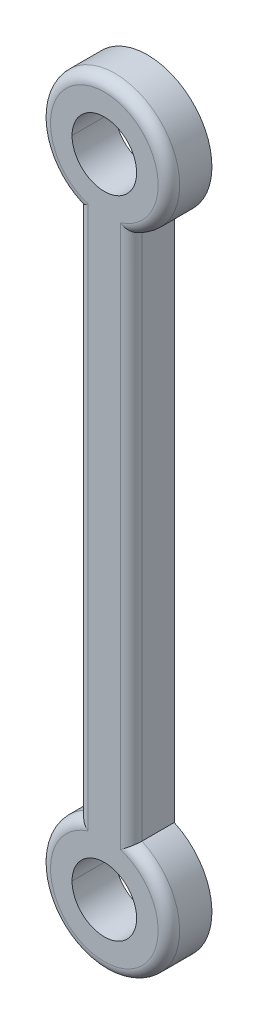
ISO-10303-21;
HEADER;
FILE_DESCRIPTION(('STEP AP214'),'2;1');
FILE_NAME('part.step','',(''),(''),'','','');
FILE_SCHEMA(('AUTOMOTIVE_DESIGN { 1 0 10303 214 1 1 1 1 }'));
ENDSEC;
DATA;
#1=APPLICATION_CONTEXT('core data for automotive mechanical design processes');
#2=APPLICATION_PROTOCOL_DEFINITION('international standard','automotive_design',2000,#1);
#3=PRODUCT_CONTEXT('',#1,'mechanical');
#4=PRODUCT('Part','Part','',(#3));
#5=PRODUCT_RELATED_PRODUCT_CATEGORY('part','',(#4));
#6=PRODUCT_DEFINITION_FORMATION('','',#4);
#7=PRODUCT_DEFINITION_CONTEXT('part definition',#1,'design');
#8=PRODUCT_DEFINITION('design','',#6,#7);
#9=PRODUCT_DEFINITION_SHAPE('','',#8);
#10=(LENGTH_UNIT() NAMED_UNIT(*) SI_UNIT(.MILLI.,.METRE.));
#11=(NAMED_UNIT(*) PLANE_ANGLE_UNIT() SI_UNIT($,.RADIAN.));
#12=(NAMED_UNIT(*) SI_UNIT($,.STERADIAN.) SOLID_ANGLE_UNIT());
#13=UNCERTAINTY_MEASURE_WITH_UNIT(LENGTH_MEASURE(1.E-05),#10,'distance_accuracy_value','');
#14=(GEOMETRIC_REPRESENTATION_CONTEXT(3) GLOBAL_UNCERTAINTY_ASSIGNED_CONTEXT((#13)) GLOBAL_UNIT_ASSIGNED_CONTEXT((#10,
#11,#12)) REPRESENTATION_CONTEXT('',''));
#15=CARTESIAN_POINT('',(0.,0.,0.));
#16=DIRECTION('',(0.,0.,1.));
#17=DIRECTION('',(1.,0.,0.));
#18=AXIS2_PLACEMENT_3D('',#15,#16,#17);
#19=CARTESIAN_POINT('',(287.2957574495,-205.174437105941,53.449999999999));
#20=DIRECTION('',(0.,0.,1.));
#21=DIRECTION('',(-1.,0.,0.));
#22=AXIS2_PLACEMENT_3D('',#19,#20,#21);
#23=PLANE('',#22);
#24=CARTESIAN_POINT('',(287.2957574495,-175.174437105941,53.4499999999991));
#25=DIRECTION('',(0.,0.,-1.));
#26=DIRECTION('',(1.,0.,0.));
#27=AXIS2_PLACEMENT_3D('',#24,#25,#26);
#28=CIRCLE('',#27,1.5);
#29=CARTESIAN_POINT('',(288.7957574495,-175.174437105941,53.4499999999991));
#30=VERTEX_POINT('',#29);
#31=CARTESIAN_POINT('',(285.7957574495,-175.174437105941,53.4499999999991));
#32=VERTEX_POINT('',#31);
#33=EDGE_CURVE('E315',#30,#32,#28,.T.);
#34=ORIENTED_EDGE('',*,*,#33,.F.);
#35=CARTESIAN_POINT('',(287.2957574495,-175.174437105941,53.4499999999991));
#36=DIRECTION('',(0.,0.,-1.));
#37=DIRECTION('',(-1.,0.,0.));
#38=AXIS2_PLACEMENT_3D('',#35,#36,#37);
#39=CIRCLE('',#38,1.5);
#40=EDGE_CURVE('E66',#32,#30,#39,.T.);
#41=ORIENTED_EDGE('',*,*,#40,.F.);
#42=EDGE_LOOP('',(#34,#41));
#43=FACE_BOUND('',#42,.T.);
#44=CARTESIAN_POINT('',(287.2957574495,-205.174437105941,53.449999999999));
#45=DIRECTION('',(0.,0.,1.));
#46=DIRECTION('',(1.,0.,0.));
#47=AXIS2_PLACEMENT_3D('',#44,#45,#46);
#48=CIRCLE('',#47,1.5);
#49=CARTESIAN_POINT('',(288.7957574495,-205.174437105941,53.449999999999));
#50=VERTEX_POINT('',#49);
#51=CARTESIAN_POINT('',(285.7957574495,-205.174437105941,53.449999999999));
#52=VERTEX_POINT('',#51);
#53=EDGE_CURVE('E11',#50,#52,#48,.T.);
#54=ORIENTED_EDGE('',*,*,#53,.T.);
#55=CARTESIAN_POINT('',(287.2957574495,-205.174437105941,53.449999999999));
#56=DIRECTION('',(0.,0.,1.));
#57=DIRECTION('',(-1.,0.,0.));
#58=AXIS2_PLACEMENT_3D('',#55,#56,#57);
#59=CIRCLE('',#58,1.5);
#60=EDGE_CURVE('E57',#52,#50,#59,.T.);
#61=ORIENTED_EDGE('',*,*,#60,.T.);
#62=EDGE_LOOP('',(#54,#61));
#63=FACE_BOUND('',#62,.T.);
#64=DIRECTION('',(0.,-1.,0.));
#65=VECTOR('',#64,1.);
#66=CARTESIAN_POINT('',(286.0457574495,-177.9016151346,53.4499999999991));
#67=LINE('',#66,#65);
#68=CARTESIAN_POINT('',(286.0457574495,-177.9016151346,53.4499999999991));
#69=VERTEX_POINT('',#68);
#70=CARTESIAN_POINT('',(286.0457574495,-202.447259077282,53.449999999999));
#71=VERTEX_POINT('',#70);
#72=EDGE_CURVE('E268',#69,#71,#67,.T.);
#73=ORIENTED_EDGE('',*,*,#72,.F.);
#74=CARTESIAN_POINT('',(287.2957574495,-175.174437105941,53.4499999999991));
#75=DIRECTION('',(0.,0.,1.));
#76=DIRECTION('',(0.416666666666667,-0.90905934288631,0.));
#77=AXIS2_PLACEMENT_3D('',#74,#75,#76);
#78=CIRCLE('',#77,3.);
#79=CARTESIAN_POINT('',(288.5457574495,-177.9016151346,53.4499999999991));
#80=VERTEX_POINT('',#79);
#81=EDGE_CURVE('E159',#80,#69,#78,.T.);
#82=ORIENTED_EDGE('',*,*,#81,.F.);
#83=DIRECTION('',(0.,1.,0.));
#84=VECTOR('',#83,1.);
#85=CARTESIAN_POINT('',(288.5457574495,-202.447259077282,53.449999999999));
#86=LINE('',#85,#84);
#87=CARTESIAN_POINT('',(288.5457574495,-202.447259077282,53.449999999999));
#88=VERTEX_POINT('',#87);
#89=EDGE_CURVE('E193',#88,#80,#86,.T.);
#90=ORIENTED_EDGE('',*,*,#89,.F.);
#91=CARTESIAN_POINT('',(287.2957574495,-205.174437105941,53.449999999999));
#92=DIRECTION('',(0.,0.,1.));
#93=DIRECTION('',(-0.416666666666667,0.90905934288631,0.));
#94=AXIS2_PLACEMENT_3D('',#91,#92,#93);
#95=CIRCLE('',#94,3.);
#96=EDGE_CURVE('E252',#71,#88,#95,.T.);
#97=ORIENTED_EDGE('',*,*,#96,.F.);
#98=EDGE_LOOP('',(#73,#82,#90,#97));
#99=FACE_BOUND('',#98,.T.);
#100=ADVANCED_FACE('F46',(#43,#63,#99),#23,.F.);
#101=CARTESIAN_POINT('',(287.2957574495,-175.174437105941,55.4499999999991));
#102=DIRECTION('',(0.,0.,1.));
#103=DIRECTION('',(-1.,0.,0.));
#104=AXIS2_PLACEMENT_3D('',#101,#102,#103);
#105=CYLINDRICAL_SURFACE('',#104,1.5);
#106=CARTESIAN_POINT('',(287.2957574495,-175.174437105941,55.4499999999991));
#107=DIRECTION('',(0.,0.,-1.));
#108=DIRECTION('',(1.,0.,0.));
#109=AXIS2_PLACEMENT_3D('',#106,#107,#108);
#110=CIRCLE('',#109,1.5);
#111=CARTESIAN_POINT('',(288.7957574495,-175.174437105941,55.4499999999991));
#112=VERTEX_POINT('',#111);
#113=CARTESIAN_POINT('',(285.7957574495,-175.174437105941,55.4499999999991));
#114=VERTEX_POINT('',#113);
#115=EDGE_CURVE('E144',#112,#114,#110,.T.);
#116=ORIENTED_EDGE('',*,*,#115,.F.);
#117=DIRECTION('',(0.,0.,-1.));
#118=VECTOR('',#117,1.);
#119=CARTESIAN_POINT('',(288.7957574495,-175.174437105941,55.4499999999991));
#120=LINE('',#119,#118);
#121=EDGE_CURVE('E309',#112,#30,#120,.T.);
#122=ORIENTED_EDGE('',*,*,#121,.T.);
#123=ORIENTED_EDGE('',*,*,#33,.T.);
#124=DIRECTION('',(0.,0.,-1.));
#125=VECTOR('',#124,1.);
#126=CARTESIAN_POINT('',(285.7957574495,-175.174437105941,55.4499999999991));
#127=LINE('',#126,#125);
#128=EDGE_CURVE('E310',#114,#32,#127,.T.);
#129=ORIENTED_EDGE('',*,*,#128,.F.);
#130=EDGE_LOOP('',(#116,#122,#123,#129));
#131=FACE_BOUND('',#130,.T.);
#132=ADVANCED_FACE('F307',(#131),#105,.F.);
#133=CARTESIAN_POINT('',(287.2957574495,-175.174437105941,55.4499999999991));
#134=DIRECTION('',(0.,0.,1.));
#135=DIRECTION('',(-1.,0.,0.));
#136=AXIS2_PLACEMENT_3D('',#133,#134,#135);
#137=CYLINDRICAL_SURFACE('',#136,1.5);
#138=ORIENTED_EDGE('',*,*,#40,.T.);
#139=ORIENTED_EDGE('',*,*,#121,.F.);
#140=CARTESIAN_POINT('',(287.2957574495,-175.174437105941,55.4499999999991));
#141=DIRECTION('',(0.,0.,-1.));
#142=DIRECTION('',(-1.,0.,0.));
#143=AXIS2_PLACEMENT_3D('',#140,#141,#142);
#144=CIRCLE('',#143,1.5);
#145=EDGE_CURVE('E155',#114,#112,#144,.T.);
#146=ORIENTED_EDGE('',*,*,#145,.F.);
#147=ORIENTED_EDGE('',*,*,#128,.T.);
#148=EDGE_LOOP('',(#138,#139,#146,#147));
#149=FACE_BOUND('',#148,.T.);
#150=ADVANCED_FACE('F314',(#149),#137,.F.);
#151=CARTESIAN_POINT('',(287.2957574495,-205.174437105941,55.449999999999));
#152=DIRECTION('',(0.,0.,-1.));
#153=DIRECTION('',(-1.,0.,0.));
#154=AXIS2_PLACEMENT_3D('',#151,#152,#153);
#155=CYLINDRICAL_SURFACE('',#154,1.5);
#156=DIRECTION('',(0.,0.,-1.));
#157=VECTOR('',#156,1.);
#158=CARTESIAN_POINT('',(288.7957574495,-205.174437105941,55.449999999999));
#159=LINE('',#158,#157);
#160=CARTESIAN_POINT('',(288.7957574495,-205.174437105941,55.449999999999));
#161=VERTEX_POINT('',#160);
#162=EDGE_CURVE('E327',#161,#50,#159,.T.);
#163=ORIENTED_EDGE('',*,*,#162,.F.);
#164=CARTESIAN_POINT('',(287.2957574495,-205.174437105941,55.449999999999));
#165=DIRECTION('',(0.,0.,1.));
#166=DIRECTION('',(1.,0.,0.));
#167=AXIS2_PLACEMENT_3D('',#164,#165,#166);
#168=CIRCLE('',#167,1.5);
#169=CARTESIAN_POINT('',(285.7957574495,-205.174437105941,55.449999999999));
#170=VERTEX_POINT('',#169);
#171=EDGE_CURVE('E325',#161,#170,#168,.T.);
#172=ORIENTED_EDGE('',*,*,#171,.T.);
#173=DIRECTION('',(0.,0.,-1.));
#174=VECTOR('',#173,1.);
#175=CARTESIAN_POINT('',(285.7957574495,-205.174437105941,55.449999999999));
#176=LINE('',#175,#174);
#177=EDGE_CURVE('E322',#170,#52,#176,.T.);
#178=ORIENTED_EDGE('',*,*,#177,.T.);
#179=ORIENTED_EDGE('',*,*,#53,.F.);
#180=EDGE_LOOP('',(#163,#172,#178,#179));
#181=FACE_BOUND('',#180,.T.);
#182=ADVANCED_FACE('F230',(#181),#155,.F.);
#183=CARTESIAN_POINT('',(287.2957574495,-205.174437105941,55.449999999999));
#184=DIRECTION('',(0.,0.,-1.));
#185=DIRECTION('',(-1.,0.,0.));
#186=AXIS2_PLACEMENT_3D('',#183,#184,#185);
#187=CYLINDRICAL_SURFACE('',#186,1.5);
#188=ORIENTED_EDGE('',*,*,#177,.F.);
#189=CARTESIAN_POINT('',(287.2957574495,-205.174437105941,55.449999999999));
#190=DIRECTION('',(0.,0.,1.));
#191=DIRECTION('',(-1.,0.,0.));
#192=AXIS2_PLACEMENT_3D('',#189,#190,#191);
#193=CIRCLE('',#192,1.5);
#194=EDGE_CURVE('E326',#170,#161,#193,.T.);
#195=ORIENTED_EDGE('',*,*,#194,.T.);
#196=ORIENTED_EDGE('',*,*,#162,.T.);
#197=ORIENTED_EDGE('',*,*,#60,.F.);
#198=EDGE_LOOP('',(#188,#195,#196,#197));
#199=FACE_BOUND('',#198,.T.);
#200=ADVANCED_FACE('F335',(#199),#187,.F.);
#201=CARTESIAN_POINT('',(286.0457574495,-177.9016151346,53.4499999999991));
#202=DIRECTION('',(-1.,0.,0.));
#203=DIRECTION('',(0.,-1.,0.));
#204=AXIS2_PLACEMENT_3D('',#201,#202,#203);
#205=PLANE('',#204);
#206=DIRECTION('',(0.,0.,1.));
#207=VECTOR('',#206,1.);
#208=CARTESIAN_POINT('',(286.0457574495,-177.9016151346,53.4499999999991));
#209=LINE('',#208,#207);
#210=CARTESIAN_POINT('',(286.0457574495,-177.901615134149,54.9499999999991));
#211=VERTEX_POINT('',#210);
#212=EDGE_CURVE('E192',#69,#211,#209,.T.);
#213=ORIENTED_EDGE('',*,*,#212,.F.);
#214=ORIENTED_EDGE('',*,*,#72,.T.);
#215=DIRECTION('',(0.,0.,1.));
#216=VECTOR('',#215,1.);
#217=CARTESIAN_POINT('',(286.0457574495,-202.447259077282,53.449999999999));
#218=LINE('',#217,#216);
#219=CARTESIAN_POINT('',(286.04575744964,-202.447259077589,54.949999999999));
#220=VERTEX_POINT('',#219);
#221=EDGE_CURVE('E264',#71,#220,#218,.T.);
#222=ORIENTED_EDGE('',*,*,#221,.T.);
#223=DIRECTION('',(0.,1.,0.));
#224=VECTOR('',#223,1.);
#225=CARTESIAN_POINT('',(286.0457574495,-202.447259077282,54.949999999999));
#226=LINE('',#225,#224);
#227=EDGE_CURVE('E153',#220,#211,#226,.T.);
#228=ORIENTED_EDGE('',*,*,#227,.T.);
#229=EDGE_LOOP('',(#213,#214,#222,#228));
#230=FACE_BOUND('',#229,.T.);
#231=ADVANCED_FACE('F298',(#230),#205,.T.);
#232=CARTESIAN_POINT('',(287.2957574495,-175.174437105941,53.4499999999991));
#233=DIRECTION('',(0.,0.,-1.));
#234=DIRECTION('',(-1.,0.,0.));
#235=AXIS2_PLACEMENT_3D('',#232,#233,#234);
#236=CYLINDRICAL_SURFACE('',#235,3.);
#237=ORIENTED_EDGE('',*,*,#81,.T.);
#238=ORIENTED_EDGE('',*,*,#212,.T.);
#239=CARTESIAN_POINT('',(287.2957574495,-175.174437105941,54.9499999999991));
#240=DIRECTION('',(0.,0.,-1.));
#241=DIRECTION('',(-0.416666666780481,-0.909059342834143,0.));
#242=AXIS2_PLACEMENT_3D('',#239,#240,#241);
#243=CIRCLE('',#242,2.99999999918055);
#244=CARTESIAN_POINT('',(288.545757449432,-177.901615134406,54.9499999999991));
#245=VERTEX_POINT('',#244);
#246=EDGE_CURVE('E112',#211,#245,#243,.T.);
#247=ORIENTED_EDGE('',*,*,#246,.T.);
#248=DIRECTION('',(0.,0.,1.));
#249=VECTOR('',#248,1.);
#250=CARTESIAN_POINT('',(288.5457574495,-177.9016151346,53.4499999999991));
#251=LINE('',#250,#249);
#252=EDGE_CURVE('E284',#80,#245,#251,.T.);
#253=ORIENTED_EDGE('',*,*,#252,.F.);
#254=EDGE_LOOP('',(#237,#238,#247,#253));
#255=FACE_BOUND('',#254,.T.);
#256=ADVANCED_FACE('F293',(#255),#236,.T.);
#257=CARTESIAN_POINT('',(288.5457574495,-202.447259077282,53.449999999999));
#258=DIRECTION('',(1.,0.,0.));
#259=DIRECTION('',(0.,1.,0.));
#260=AXIS2_PLACEMENT_3D('',#257,#258,#259);
#261=PLANE('',#260);
#262=DIRECTION('',(0.,0.,1.));
#263=VECTOR('',#262,1.);
#264=CARTESIAN_POINT('',(288.5457574495,-202.447259077282,53.449999999999));
#265=LINE('',#264,#263);
#266=CARTESIAN_POINT('',(288.545757449359,-202.447259077589,54.949999999999));
#267=VERTEX_POINT('',#266);
#268=EDGE_CURVE('E246',#88,#267,#265,.T.);
#269=ORIENTED_EDGE('',*,*,#268,.F.);
#270=ORIENTED_EDGE('',*,*,#89,.T.);
#271=ORIENTED_EDGE('',*,*,#252,.T.);
#272=DIRECTION('',(0.,-1.,0.));
#273=VECTOR('',#272,1.);
#274=CARTESIAN_POINT('',(288.5457574495,-177.9016151346,54.9499999999991));
#275=LINE('',#274,#273);
#276=EDGE_CURVE('E255',#245,#267,#275,.T.);
#277=ORIENTED_EDGE('',*,*,#276,.T.);
#278=EDGE_LOOP('',(#269,#270,#271,#277));
#279=FACE_BOUND('',#278,.T.);
#280=ADVANCED_FACE('F287',(#279),#261,.T.);
#281=CARTESIAN_POINT('',(287.2957574495,-205.174437105941,53.449999999999));
#282=DIRECTION('',(0.,0.,-1.));
#283=DIRECTION('',(-1.,0.,0.));
#284=AXIS2_PLACEMENT_3D('',#281,#282,#283);
#285=CYLINDRICAL_SURFACE('',#284,3.);
#286=ORIENTED_EDGE('',*,*,#221,.F.);
#287=ORIENTED_EDGE('',*,*,#96,.T.);
#288=ORIENTED_EDGE('',*,*,#268,.T.);
#289=CARTESIAN_POINT('',(287.2957574495,-205.174437105941,54.949999999999));
#290=DIRECTION('',(0.,0.,-1.));
#291=DIRECTION('',(0.416666666666667,0.909059342886309,0.));
#292=AXIS2_PLACEMENT_3D('',#289,#290,#291);
#293=CIRCLE('',#292,2.99999999932575);
#294=EDGE_CURVE('E103',#267,#220,#293,.T.);
#295=ORIENTED_EDGE('',*,*,#294,.T.);
#296=EDGE_LOOP('',(#286,#287,#288,#295));
#297=FACE_BOUND('',#296,.T.);
#298=ADVANCED_FACE('F175',(#297),#285,.T.);
#299=CARTESIAN_POINT('',(287.2957574495,-205.174437105941,55.449999999999));
#300=DIRECTION('',(0.,0.,1.));
#301=DIRECTION('',(-1.,0.,0.));
#302=AXIS2_PLACEMENT_3D('',#299,#300,#301);
#303=PLANE('',#302);
#304=DIRECTION('',(0.,1.,0.));
#305=VECTOR('',#304,1.);
#306=CARTESIAN_POINT('',(288.0457574495,-202.789589103105,55.449999999999));
#307=LINE('',#306,#305);
#308=CARTESIAN_POINT('',(288.0457574495,-202.789589103105,55.449999999999));
#309=VERTEX_POINT('',#308);
#310=CARTESIAN_POINT('',(288.0457574495,-177.559285108624,55.4499999999991));
#311=VERTEX_POINT('',#310);
#312=EDGE_CURVE('E200',#309,#311,#307,.T.);
#313=ORIENTED_EDGE('',*,*,#312,.T.);
#314=CARTESIAN_POINT('',(287.2957574495,-175.174437105941,55.4499999999991));
#315=DIRECTION('',(0.,0.,1.));
#316=DIRECTION('',(0.300000000098334,-0.953939201386021,0.));
#317=AXIS2_PLACEMENT_3D('',#314,#315,#316);
#318=CIRCLE('',#317,2.49999999918055);
#319=CARTESIAN_POINT('',(286.5457574495,-177.559285108624,55.4499999999991));
#320=VERTEX_POINT('',#319);
#321=EDGE_CURVE('E148',#311,#320,#318,.T.);
#322=ORIENTED_EDGE('',*,*,#321,.T.);
#323=DIRECTION('',(0.,-1.,0.));
#324=VECTOR('',#323,1.);
#325=CARTESIAN_POINT('',(286.5457574495,-177.559285108624,55.4499999999991));
#326=LINE('',#325,#324);
#327=CARTESIAN_POINT('',(286.545757449511,-202.789589103084,55.449999999999));
#328=VERTEX_POINT('',#327);
#329=EDGE_CURVE('E128',#320,#328,#326,.T.);
#330=ORIENTED_EDGE('',*,*,#329,.T.);
#331=CARTESIAN_POINT('',(287.2957574495,-205.174437105941,55.449999999999));
#332=DIRECTION('',(0.,0.,1.));
#333=DIRECTION('',(-0.300000000074611,0.953939201393482,0.));
#334=AXIS2_PLACEMENT_3D('',#331,#332,#333);
#335=CIRCLE('',#334,2.49999999932575);
#336=EDGE_CURVE('E135',#328,#309,#335,.T.);
#337=ORIENTED_EDGE('',*,*,#336,.T.);
#338=EDGE_LOOP('',(#313,#322,#330,#337));
#339=FACE_BOUND('',#338,.T.);
#340=ORIENTED_EDGE('',*,*,#115,.T.);
#341=ORIENTED_EDGE('',*,*,#145,.T.);
#342=EDGE_LOOP('',(#340,#341));
#343=FACE_BOUND('',#342,.T.);
#344=ORIENTED_EDGE('',*,*,#171,.F.);
#345=ORIENTED_EDGE('',*,*,#194,.F.);
#346=EDGE_LOOP('',(#344,#345));
#347=FACE_BOUND('',#346,.T.);
#348=ADVANCED_FACE('F146',(#339,#343,#347),#303,.T.);
#349=CARTESIAN_POINT('',(286.5457574495,-255.104037105941,54.9499999999988));
#350=DIRECTION('',(0.,-1.,0.));
#351=DIRECTION('',(-1.,0.,0.));
#352=AXIS2_PLACEMENT_3D('',#349,#350,#351);
#353=CYLINDRICAL_SURFACE('',#352,0.5);
#354=CARTESIAN_POINT('',(286.0457574495,-177.901615133698,54.9499999999991));
#355=CARTESIAN_POINT('',(286.045779837128,-177.901625432464,54.9544047902568));
#356=CARTESIAN_POINT('',(286.045859260718,-177.90159777045,54.9588093734913));
#357=CARTESIAN_POINT('',(286.046131946649,-177.901466694506,54.967614633718));
#358=CARTESIAN_POINT('',(286.046325228254,-177.901363267758,54.972015309923));
#359=CARTESIAN_POINT('',(286.046825498199,-177.901080767123,54.9808096846342));
#360=CARTESIAN_POINT('',(286.04713253602,-177.900901660314,54.9852033792671));
#361=CARTESIAN_POINT('',(286.047860061926,-177.900467974781,54.993980734077));
#362=CARTESIAN_POINT('',(286.048280629309,-177.900213343293,54.9983643850721));
#363=CARTESIAN_POINT('',(286.049234899879,-177.899628813301,55.007118606717));
#364=CARTESIAN_POINT('',(286.049768711615,-177.899298842558,55.0114891607071));
#365=CARTESIAN_POINT('',(286.050949081371,-177.898563879302,55.0202141569563));
#366=CARTESIAN_POINT('',(286.051595776428,-177.898158795564,55.024568572986));
#367=CARTESIAN_POINT('',(286.053001453677,-177.897273888789,55.0332582780555));
#368=CARTESIAN_POINT('',(286.053760600464,-177.896793956139,55.0375935292992));
#369=CARTESIAN_POINT('',(286.055390651831,-177.895759671873,55.0462419076748));
#370=CARTESIAN_POINT('',(286.056261747471,-177.895205192955,55.0505549835602));
#371=CARTESIAN_POINT('',(286.05811509835,-177.894022173861,55.059156034517));
#372=CARTESIAN_POINT('',(286.059097569868,-177.893393489486,55.0634439431374));
#373=CARTESIAN_POINT('',(286.061173005633,-177.892062454878,55.0719917038903));
#374=CARTESIAN_POINT('',(286.062266209997,-177.89135994443,55.0762514727533));
#375=CARTESIAN_POINT('',(286.064562379261,-177.889881689071,55.084740026206));
#376=CARTESIAN_POINT('',(286.065765606625,-177.889105768879,55.0889687092596));
#377=CARTESIAN_POINT('',(286.068281016521,-177.887481167091,55.0973921744641));
#378=CARTESIAN_POINT('',(286.069593482242,-177.886632296182,55.101586835481));
#379=CARTESIAN_POINT('',(286.072326524683,-177.884862285882,55.1099394226563));
#380=CARTESIAN_POINT('',(286.073747403708,-177.883940944172,55.1140972071149));
#381=CARTESIAN_POINT('',(286.076696266204,-177.88202658626,55.12237303055));
#382=CARTESIAN_POINT('',(286.078224569047,-177.881033356049,55.1264909056912));
#383=CARTESIAN_POINT('',(286.082976911252,-177.877941646902,55.1388018793954));
#384=CARTESIAN_POINT('',(286.086354722765,-177.875739996141,55.1469106140915));
#385=CARTESIAN_POINT('',(286.093524869606,-177.871058249868,55.162936301087));
#386=CARTESIAN_POINT('',(286.097320088119,-177.868576213972,55.170851389583));
#387=CARTESIAN_POINT('',(286.105315619468,-177.863339257565,55.1864691914458));
#388=CARTESIAN_POINT('',(286.109518962138,-177.860582291179,55.1941696676691));
#389=CARTESIAN_POINT('',(286.118320006595,-177.854801880166,55.2093372061692));
#390=CARTESIAN_POINT('',(286.122920823577,-177.851776324206,55.2168016521259));
#391=CARTESIAN_POINT('',(286.13250581798,-177.845465378875,55.23147758913));
#392=CARTESIAN_POINT('',(286.137493146136,-177.842177846076,55.238686103886));
#393=CARTESIAN_POINT('',(286.145344544937,-177.836996462688,55.2494206134998));
#394=CARTESIAN_POINT('',(286.148092813232,-177.835181756592,55.2530704933048));
#395=CARTESIAN_POINT('',(286.153688887596,-177.831484679143,55.2602930509166));
#396=CARTESIAN_POINT('',(286.156537133938,-177.829602007071,55.2638652334503));
#397=CARTESIAN_POINT('',(286.16525093372,-177.823838424639,55.2744903395455));
#398=CARTESIAN_POINT('',(286.171242833726,-177.819870121991,55.2813934918684));
#399=CARTESIAN_POINT('',(286.181979864273,-177.812756978913,55.2930916061969));
#400=CARTESIAN_POINT('',(286.186656584702,-177.809658013504,55.297977838054));
#401=CARTESIAN_POINT('',(286.193826468058,-177.804905979206,55.3051664623187));
#402=CARTESIAN_POINT('',(286.196259781022,-177.803293066022,55.3075553960056));
#403=CARTESIAN_POINT('',(286.201188787407,-177.800024449239,55.3122955373252));
#404=CARTESIAN_POINT('',(286.203684852197,-177.798368485925,55.3146461792439));
#405=CARTESIAN_POINT('',(286.211532224789,-177.793159251451,55.3218846655421));
#406=CARTESIAN_POINT('',(286.216950662447,-177.789558023044,55.326665851908));
#407=CARTESIAN_POINT('',(286.228048783621,-177.78216783307,55.3360420554441));
#408=CARTESIAN_POINT('',(286.233731494122,-177.778376586624,55.340631675271));
#409=CARTESIAN_POINT('',(286.245351238092,-177.770605480311,55.3496086194362));
#410=CARTESIAN_POINT('',(286.251291054476,-177.766623402821,55.3539904211321));
#411=CARTESIAN_POINT('',(286.263417123195,-177.758470700991,55.3625351703367));
#412=CARTESIAN_POINT('',(286.269605907344,-177.754297942402,55.366692484145));
#413=CARTESIAN_POINT('',(286.282221500532,-177.745764714628,55.3747716835823));
#414=CARTESIAN_POINT('',(286.288650593541,-177.741402205639,55.3786878450191));
#415=CARTESIAN_POINT('',(286.301737767358,-177.732491202101,55.3862681110049));
#416=CARTESIAN_POINT('',(286.308397886973,-177.72794077394,55.3899264188261));
#417=CARTESIAN_POINT('',(286.321937505467,-177.71865658219,55.3969743855319));
#418=CARTESIAN_POINT('',(286.328818802754,-177.71392100202,55.4003581929172));
#419=CARTESIAN_POINT('',(286.342790615448,-177.704270138903,55.4068406635451));
#420=CARTESIAN_POINT('',(286.349882694743,-177.699353166727,55.4099334374425));
#421=CARTESIAN_POINT('',(286.364265394013,-177.68934418405,55.4158175162508));
#422=CARTESIAN_POINT('',(286.37155735039,-177.684250621339,55.4186029102421));
#423=CARTESIAN_POINT('',(286.386328649591,-177.673894202374,55.4238561492784));
#424=CARTESIAN_POINT('',(286.393809109314,-177.668629939939,55.4263180774069));
#425=CARTESIAN_POINT('',(286.408945830426,-177.65793899159,55.4309086281934));
#426=CARTESIAN_POINT('',(286.41660299802,-177.652511053839,55.4330313428327));
#427=CARTESIAN_POINT('',(286.432081173888,-177.641500791915,55.436928115922));
#428=CARTESIAN_POINT('',(286.439902887211,-177.635917377861,55.4386962894692));
#429=CARTESIAN_POINT('',(286.45569787113,-177.624605403611,55.4418691183599));
#430=CARTESIAN_POINT('',(286.463671655663,-177.618875922366,55.4432679254093));
#431=CARTESIAN_POINT('',(286.479758263845,-177.607282292875,55.4456877439528));
#432=CARTESIAN_POINT('',(286.487871421171,-177.601417398608,55.4467029566689));
#433=CARTESIAN_POINT('',(286.504224011868,-177.589564674352,55.4483419537045));
#434=CARTESIAN_POINT('',(286.512463608705,-177.583576278649,55.4489600005042));
#435=CARTESIAN_POINT('',(286.529056464585,-177.571489605415,55.4497918874214));
#436=CARTESIAN_POINT('',(286.537409731649,-177.565390947753,55.4500000639232));
#437=CARTESIAN_POINT('',(286.5457574495,-177.559285108624,55.4499999999991));
#438=B_SPLINE_CURVE_WITH_KNOTS('',3,(#354,#355,#356,#357,#358,#359,#360,#361,#362,#363,#364,
#365,#366,#367,#368,#369,#370,#371,#372,#373,#374,#375,#376,#377,#378,#379,#380,#381,#382,#383,
#384,#385,#386,#387,#388,#389,#390,#391,#392,#393,#394,#395,#396,#397,#398,#399,#400,#401,#402,
#403,#404,#405,#406,#407,#408,#409,#410,#411,#412,#413,#414,#415,#416,#417,#418,#419,#420,#421,
#422,#423,#424,#425,#426,#427,#428,#429,#430,#431,#432,#433,#434,#435,#436,#437),.UNSPECIFIED.,
.F.,.F.,(4,2,2,2,2,2,2,2,2,2,2,2,2,2,2,2,2,2,2,2,2,2,2,2,2,2,2,2,2,2,2,2,2,2,2,2,2,2,2,2,2,4),
(0.,0.0132140372310108,0.0264303107231752,0.0396523396862413,0.0528836280851831,
0.0661276570346559,0.0793878773243679,0.0926677021161039,0.105970499851102,0.119299587403822,
0.132658223515884,0.146049602540504,0.159476848524332,0.172943009650873,0.186451053064821,
0.213601249523294,0.240952407870623,0.268524917515438,0.29633751582863,0.324407222898681,
0.339153661903597,0.353976157930015,0.383853589656665,0.406166891569851,0.417482754915366,
0.428904987790185,0.453118779717082,0.477801420642341,0.502954483710924,0.528578490848784,
0.554672977441427,0.581236558333347,0.608266995090843,0.635761264504113,0.663715628324193,
0.692125704237261,0.720986538077347,0.750292677266178,0.780038245454759,0.810217018316899,
0.840822500423314,0.871848003094876),.UNSPECIFIED.);
#439=EDGE_CURVE('E156',#211,#320,#438,.T.);
#440=ORIENTED_EDGE('',*,*,#439,.F.);
#441=ORIENTED_EDGE('',*,*,#227,.F.);
#442=CARTESIAN_POINT('',(286.0457574495,-202.447259077895,54.949999999999));
#443=CARTESIAN_POINT('',(286.045757409758,-202.447279302494,54.9545077970513));
#444=CARTESIAN_POINT('',(286.045818408736,-202.44733666046,54.9590154240033));
#445=CARTESIAN_POINT('',(286.046062140457,-202.4475256271,54.9680246701911));
#446=CARTESIAN_POINT('',(286.046244841957,-202.447657216717,54.9725262906718));
#447=CARTESIAN_POINT('',(286.046731638999,-202.447994643536,54.981520241955));
#448=CARTESIAN_POINT('',(286.047035736359,-202.448200481852,54.9860125726175));
#449=CARTESIAN_POINT('',(286.047764838307,-202.448686381313,54.9949846845511));
#450=CARTESIAN_POINT('',(286.048189877525,-202.448966463715,54.9994644618562));
#451=CARTESIAN_POINT('',(286.049160305345,-202.449600832434,55.0084082279584));
#452=CARTESIAN_POINT('',(286.049705760954,-202.44995516006,55.0128722065533));
#453=CARTESIAN_POINT('',(286.050916373477,-202.450737998873,55.0217811600527));
#454=CARTESIAN_POINT('',(286.051581629164,-202.451166571263,55.026226116154));
#455=CARTESIAN_POINT('',(286.053031109911,-202.452097879847,55.0350938353663));
#456=CARTESIAN_POINT('',(286.053815464732,-202.452600696915,55.0395165687685));
#457=CARTESIAN_POINT('',(286.055502327558,-202.453680475236,55.048336681421));
#458=CARTESIAN_POINT('',(286.056404995368,-202.454257536751,55.0527340178265));
#459=CARTESIAN_POINT('',(286.058327585222,-202.455485784654,55.0615002056142));
#460=CARTESIAN_POINT('',(286.059347696016,-202.456137090349,55.0658689988733));
#461=CARTESIAN_POINT('',(286.061504191107,-202.457513807758,55.074575001772));
#462=CARTESIAN_POINT('',(286.062640791855,-202.458239357423,55.0789121359675));
#463=CARTESIAN_POINT('',(286.065029205779,-202.459764543953,55.0875517569041));
#464=CARTESIAN_POINT('',(286.066281261728,-202.460564336957,55.0918541489501));
#465=CARTESIAN_POINT('',(286.068899445024,-202.462237993279,55.1004212568783));
#466=CARTESIAN_POINT('',(286.070265839956,-202.463112030425,55.1046858570027));
#467=CARTESIAN_POINT('',(286.073111484662,-202.464934153176,55.113174395599));
#468=CARTESIAN_POINT('',(286.074591025214,-202.46588242973,55.1173981955852));
#469=CARTESIAN_POINT('',(286.07766165861,-202.467853030597,55.1258021705468));
#470=CARTESIAN_POINT('',(286.079253063674,-202.468875562445,55.1299821827188));
#471=CARTESIAN_POINT('',(286.082546083059,-202.470994596638,55.1382957288855));
#472=CARTESIAN_POINT('',(286.084248029333,-202.472091322237,55.1424290745731));
#473=CARTESIAN_POINT('',(286.087760583476,-202.474358956656,55.1506462234404));
#474=CARTESIAN_POINT('',(286.089571540707,-202.475530104736,55.1547298107249));
#475=CARTESIAN_POINT('',(286.094873453136,-202.478964217841,55.1662671926857));
#476=CARTESIAN_POINT('',(286.098486178181,-202.481310479472,55.1736408614319));
#477=CARTESIAN_POINT('',(286.106100976009,-202.486264808156,55.188267349438));
#478=CARTESIAN_POINT('',(286.110108635742,-202.488876656109,55.1955159663493));
#479=CARTESIAN_POINT('',(286.118512961436,-202.494362797228,55.2098701932706));
#480=CARTESIAN_POINT('',(286.12291520144,-202.49724087903,55.2169710906822));
#481=CARTESIAN_POINT('',(286.132106839458,-202.503259317249,55.2310067559877));
#482=CARTESIAN_POINT('',(286.136901743794,-202.506403437003,55.2379362992361));
#483=CARTESIAN_POINT('',(286.146875545559,-202.512954038611,55.2516058766629));
#484=CARTESIAN_POINT('',(286.152059833164,-202.516364246773,55.2583401879736));
#485=CARTESIAN_POINT('',(286.162807828113,-202.523447014856,55.2715955963321));
#486=CARTESIAN_POINT('',(286.168376762761,-202.527123248339,55.2781104874011));
#487=CARTESIAN_POINT('',(286.179887873127,-202.534738280361,55.2909030189959));
#488=CARTESIAN_POINT('',(286.185835066404,-202.538680692221,55.2971739872716));
#489=CARTESIAN_POINT('',(286.19809546243,-202.546827557342,55.3094549003483));
#490=CARTESIAN_POINT('',(286.204413440057,-202.551035540279,55.315457735864));
#491=CARTESIAN_POINT('',(286.216352006507,-202.559012492529,55.3262273325842));
#492=CARTESIAN_POINT('',(286.221941213109,-202.562756874482,55.3310472622883));
#493=CARTESIAN_POINT('',(286.233432211232,-202.570475228839,55.3405252004148));
#494=CARTESIAN_POINT('',(286.239338372399,-202.57445268527,55.3451750747132));
#495=CARTESIAN_POINT('',(286.251463063578,-202.582636725387,55.3542893563515));
#496=CARTESIAN_POINT('',(286.257685721064,-202.586846597643,55.3587453127344));
#497=CARTESIAN_POINT('',(286.27044148346,-202.595495811679,55.3674473687514));
#498=CARTESIAN_POINT('',(286.276978442185,-202.599938278908,55.3716847080872));
#499=CARTESIAN_POINT('',(286.290359221721,-202.609052840452,55.3799245142334));
#500=CARTESIAN_POINT('',(286.297206595465,-202.613727901541,55.3839179235254));
#501=CARTESIAN_POINT('',(286.311202986057,-202.62330764577,55.3916443490686));
#502=CARTESIAN_POINT('',(286.3183552313,-202.628215142106,55.3953680244183));
#503=CARTESIAN_POINT('',(286.332953654067,-202.638260570357,55.4025288000276));
#504=CARTESIAN_POINT('',(286.340402692553,-202.643401191722,55.405956284375));
#505=CARTESIAN_POINT('',(286.355587360358,-202.65391040398,55.4124990143427));
#506=CARTESIAN_POINT('',(286.363325515197,-202.659281486676,55.4156044056444));
#507=CARTESIAN_POINT('',(286.376881776077,-202.668735840419,55.4206581126407));
#508=CARTESIAN_POINT('',(286.382682280551,-202.672795355405,55.422698698013));
#509=CARTESIAN_POINT('',(286.394704371366,-202.681239174383,55.4266819470244));
#510=CARTESIAN_POINT('',(286.400928445487,-202.685627208762,55.4286092200471));
#511=CARTESIAN_POINT('',(286.413802152581,-202.694726443255,55.4323229381458));
#512=CARTESIAN_POINT('',(286.42045421798,-202.699440794882,55.4340932139919));
#513=CARTESIAN_POINT('',(286.434184173381,-202.709193680966,55.4374466367771));
#514=CARTESIAN_POINT('',(286.441264207555,-202.714235045436,55.439012776631));
#515=CARTESIAN_POINT('',(286.455847534722,-202.724642101513,55.4419090207018));
#516=CARTESIAN_POINT('',(286.463352577297,-202.730010308062,55.4432212767842));
#517=CARTESIAN_POINT('',(286.478779399315,-202.74107139792,55.445558224172));
#518=CARTESIAN_POINT('',(286.486702390062,-202.746766542476,55.4465642225092));
#519=CARTESIAN_POINT('',(286.502954256021,-202.758481661986,55.4482347791461));
#520=CARTESIAN_POINT('',(286.511283670007,-202.764503673529,55.4488798101124));
#521=CARTESIAN_POINT('',(286.528332434159,-202.776873011996,55.449772618669));
#522=CARTESIAN_POINT('',(286.53705150506,-202.783222199322,55.4500000622472));
#523=CARTESIAN_POINT('',(286.545757449516,-202.7895891031,55.449999999999));
#524=B_SPLINE_CURVE_WITH_KNOTS('',3,(#442,#443,#444,#445,#446,#447,#448,#449,#450,#451,#452,
#453,#454,#455,#456,#457,#458,#459,#460,#461,#462,#463,#464,#465,#466,#467,#468,#469,#470,#471,
#472,#473,#474,#475,#476,#477,#478,#479,#480,#481,#482,#483,#484,#485,#486,#487,#488,#489,#490,
#491,#492,#493,#494,#495,#496,#497,#498,#499,#500,#501,#502,#503,#504,#505,#506,#507,#508,#509,
#510,#511,#512,#513,#514,#515,#516,#517,#518,#519,#520,#521,#522,#523),.UNSPECIFIED.,.F.,.F.,(4,
2,2,2,2,2,2,2,2,2,2,2,2,2,2,2,2,2,2,2,2,2,2,2,2,2,2,2,2,2,2,2,2,2,2,2,2,2,2,2,4),(0.,
0.0135229562709099,0.0270424422814803,0.04056213074911,0.0540856942262639,0.0676168021101641,
0.0811591176654201,0.0947162950713955,0.10829197650635,0.121889789279583,0.135513343022872,
0.149166226951328,0.162852007203762,0.176574224271704,0.190336390525175,0.204141987843129,
0.217994465354706,0.243599832289463,0.269641655234219,0.296138559156279,0.323108226179807,
0.350567425111561,0.378532044101516,0.407017125550042,0.436036902488066,0.460857312558474,
0.486362386994188,0.512559225277233,0.539454378850675,0.567053901643239,0.595363395474642,
0.624388050862859,0.654132683710167,0.676233571707926,0.699795463269879,0.724820018951914,
0.751308620169902,0.779262427232004,0.80868242302939,0.839569446426748,0.8719242181287),.UNSPECIFIED.);
#525=EDGE_CURVE('E136',#220,#328,#524,.T.);
#526=ORIENTED_EDGE('',*,*,#525,.T.);
#527=ORIENTED_EDGE('',*,*,#329,.F.);
#528=EDGE_LOOP('',(#440,#441,#526,#527));
#529=FACE_BOUND('',#528,.T.);
#530=ADVANCED_FACE('F151',(#529),#353,.T.);
#531=CARTESIAN_POINT('',(287.2957574495,-175.174437105941,54.9499999999991));
#532=DIRECTION('',(0.,0.,1.));
#533=DIRECTION('',(-0.389896985072713,-0.920858480457887,0.));
#534=AXIS2_PLACEMENT_3D('',#531,#532,#533);
#535=TOROIDAL_SURFACE('',#534,2.49999999918055,0.5);
#536=ORIENTED_EDGE('',*,*,#439,.T.);
#537=ORIENTED_EDGE('',*,*,#321,.F.);
#538=CARTESIAN_POINT('',(288.0457574495,-177.559285108624,55.4499999999991));
#539=CARTESIAN_POINT('',(288.054019143203,-177.56532803216,55.4500000567938));
#540=CARTESIAN_POINT('',(288.062286850061,-177.571363111782,55.4497961543273));
#541=CARTESIAN_POINT('',(288.078705439103,-177.583318750055,55.4489818154489));
#542=CARTESIAN_POINT('',(288.086856312768,-177.589239717833,55.4483771940809));
#543=CARTESIAN_POINT('',(288.103028528428,-177.600954367461,55.4467747784762));
#544=CARTESIAN_POINT('',(288.11105002082,-177.606748644173,55.4457828660071));
#545=CARTESIAN_POINT('',(288.126950641221,-177.618198532707,55.4434200308337));
#546=CARTESIAN_POINT('',(288.134830093175,-177.623854918385,55.4420550441207));
#547=CARTESIAN_POINT('',(288.150434066353,-177.635018940288,55.4389608231961));
#548=CARTESIAN_POINT('',(288.158159094892,-177.640527522864,55.4372375676455));
#549=CARTESIAN_POINT('',(288.173441908418,-177.651387133845,55.4334421083449));
#550=CARTESIAN_POINT('',(288.181000394756,-177.656739273632,55.4313759133964));
#551=CARTESIAN_POINT('',(288.195938149503,-177.667278432341,55.4269103155393));
#552=CARTESIAN_POINT('',(288.203318323188,-177.672466719586,55.4245169386083));
#553=CARTESIAN_POINT('',(288.217887867563,-177.682671803747,55.4194130751298));
#554=CARTESIAN_POINT('',(288.225078356897,-177.687690017145,55.4167086182046));
#555=CARTESIAN_POINT('',(288.239257388474,-177.697549734952,55.4109989696851));
#556=CARTESIAN_POINT('',(288.246247271517,-177.70239279458,55.4079997972984));
#557=CARTESIAN_POINT('',(288.260014430119,-177.711898088013,55.4017172923252));
#558=CARTESIAN_POINT('',(288.266793276716,-177.716562005733,55.3984399539288));
#559=CARTESIAN_POINT('',(288.280128224998,-177.725705946988,55.3916178181351));
#560=CARTESIAN_POINT('',(288.286686135175,-177.730187772545,55.3880789747425));
#561=CARTESIAN_POINT('',(288.299569621045,-177.738965459638,55.3807505867415));
#562=CARTESIAN_POINT('',(288.305897249054,-177.74326323011,55.3769669402202));
#563=CARTESIAN_POINT('',(288.318311177957,-177.751671664048,55.3691656999583));
#564=CARTESIAN_POINT('',(288.324399779817,-177.755784331982,55.3651539319543));
#565=CARTESIAN_POINT('',(288.336327195841,-177.763822344875,55.3569131226099));
#566=CARTESIAN_POINT('',(288.342168564796,-177.767749776917,55.3526898178676));
#567=CARTESIAN_POINT('',(288.353593909835,-177.775417764176,55.3440425300172));
#568=CARTESIAN_POINT('',(288.359180692227,-177.779160479818,55.3396241757648));
#569=CARTESIAN_POINT('',(288.370089007572,-177.78646083549,55.3306030449663));
#570=CARTESIAN_POINT('',(288.375413616482,-177.790020684772,55.3260057743219));
#571=CARTESIAN_POINT('',(288.387105783944,-177.797832429596,55.3154598207914));
#572=CARTESIAN_POINT('',(288.393431805793,-177.802055352321,55.3094433694405));
#573=CARTESIAN_POINT('',(288.405749194863,-177.810266452167,55.2970845387065));
#574=CARTESIAN_POINT('',(288.411743441539,-177.81425667419,55.2907463881378));
#575=CARTESIAN_POINT('',(288.423382865137,-177.821994498085,55.2777615482633));
#576=CARTESIAN_POINT('',(288.429031068805,-177.825744223474,55.2711188418605));
#577=CARTESIAN_POINT('',(288.439965332015,-177.832992879589,55.2575436681792));
#578=CARTESIAN_POINT('',(288.445254526769,-177.836493998759,55.2506148977072));
#579=CARTESIAN_POINT('',(288.455458269314,-177.843238174408,55.2364870315897));
#580=CARTESIAN_POINT('',(288.46037602479,-177.846483454504,55.2292913170922));
#581=CARTESIAN_POINT('',(288.469825245927,-177.852709275888,55.214649771201));
#582=CARTESIAN_POINT('',(288.474359947695,-177.85569204637,55.2072069787989));
#583=CARTESIAN_POINT('',(288.483032274316,-177.861386843993,55.1920921745861));
#584=CARTESIAN_POINT('',(288.487173115101,-177.864101072791,55.1844228396242));
#585=CARTESIAN_POINT('',(288.495047885167,-177.869253447733,55.1688763953566));
#586=CARTESIAN_POINT('',(288.498784956928,-177.871693732796,55.1610015890969));
#587=CARTESIAN_POINT('',(288.50584325929,-177.876293489688,55.1450664571396));
#588=CARTESIAN_POINT('',(288.509167503358,-177.878455001538,55.1370080552411));
#589=CARTESIAN_POINT('',(288.515392517061,-177.882493308633,55.1207275029259));
#590=CARTESIAN_POINT('',(288.518296111424,-177.884372006704,55.1125069107421));
#591=CARTESIAN_POINT('',(288.522334547461,-177.886977675166,55.1000529849081));
#592=CARTESIAN_POINT('',(288.523625186819,-177.887809117944,55.0958911531938));
#593=CARTESIAN_POINT('',(288.526098524413,-177.889399858916,55.0875353852015));
#594=CARTESIAN_POINT('',(288.527281527162,-177.890159360903,55.0833415783399));
#595=CARTESIAN_POINT('',(288.529538829361,-177.891605840287,55.0749249232514));
#596=CARTESIAN_POINT('',(288.530613413947,-177.892293008139,55.0707021841408));
#597=CARTESIAN_POINT('',(288.532653273301,-177.893594534672,55.0622305322311));
#598=CARTESIAN_POINT('',(288.53361881199,-177.89420906932,55.057981710061));
#599=CARTESIAN_POINT('',(288.535440018307,-177.895365068183,55.0494608314348));
#600=CARTESIAN_POINT('',(288.536295927204,-177.895906692994,55.0451888483432));
#601=CARTESIAN_POINT('',(288.537897388145,-177.896916653249,55.0366245849772));
#602=CARTESIAN_POINT('',(288.538643157404,-177.897385133056,55.0323323623592));
#603=CARTESIAN_POINT('',(288.540023921174,-177.898248621324,55.0237305717611));
#604=CARTESIAN_POINT('',(288.54065910759,-177.898643757146,55.0194210473802));
#605=CARTESIAN_POINT('',(288.541818358465,-177.89936041379,55.0107876125591));
#606=CARTESIAN_POINT('',(288.542342588396,-177.899682044289,55.0064637334489));
#607=CARTESIAN_POINT('',(288.543279648232,-177.900251583637,54.9978045550501));
#608=CARTESIAN_POINT('',(288.543692616206,-177.900499583895,54.9934692767197));
#609=CARTESIAN_POINT('',(288.544406948097,-177.900921795808,54.9847902703287));
#610=CARTESIAN_POINT('',(288.544708421868,-177.901096080121,54.9804465548472));
#611=CARTESIAN_POINT('',(288.545199618287,-177.901370822226,54.9717536453481));
#612=CARTESIAN_POINT('',(288.545389421952,-177.901471333557,54.9674044576022));
#613=CARTESIAN_POINT('',(288.545657251763,-177.901598559516,54.9587035801132));
#614=CARTESIAN_POINT('',(288.545735329609,-177.901625308284,54.9543518924601));
#615=CARTESIAN_POINT('',(288.545757449159,-177.901615133855,54.9499999999991));
#616=B_SPLINE_CURVE_WITH_KNOTS('',3,(#538,#539,#540,#541,#542,#543,#544,#545,#546,#547,#548,
#549,#550,#551,#552,#553,#554,#555,#556,#557,#558,#559,#560,#561,#562,#563,#564,#565,#566,#567,
#568,#569,#570,#571,#572,#573,#574,#575,#576,#577,#578,#579,#580,#581,#582,#583,#584,#585,#586,
#587,#588,#589,#590,#591,#592,#593,#594,#595,#596,#597,#598,#599,#600,#601,#602,#603,#604,#605,
#606,#607,#608,#609,#610,#611,#612,#613,#614,#615),.UNSPECIFIED.,.F.,.F.,(4,2,2,2,2,2,2,2,2,2,2,
2,2,2,2,2,2,2,2,2,2,2,2,2,2,2,2,2,2,2,2,2,2,2,2,2,2,2,4),(0.,0.0307058121844005,
0.0609755164168042,0.0908023573991819,0.120179777996346,0.149101495470735,0.177561576650853,
0.20555451198143,0.233075288437272,0.260119461314087,0.286683224940272,0.312763482377695,
0.338357914199368,0.363465046443545,0.388084317845697,0.412216146439431,0.435861995593596,
0.464942071229996,0.493707633523409,0.522168265409623,0.550335249578233,0.5782215965038,
0.605842052892529,0.633213088529424,0.66035285974999,0.687281148123954,0.71401927342849,
0.727325567678492,0.740592963788887,0.753824504134337,0.767023301447226,0.78019253318496,
0.793335435569573,0.806455297324263,0.819555453135046,0.832639276868621,0.845710174580135,
0.858771577346952,0.871826933966592),.UNSPECIFIED.);
#617=EDGE_CURVE('E205',#311,#245,#616,.T.);
#618=ORIENTED_EDGE('',*,*,#617,.T.);
#619=ORIENTED_EDGE('',*,*,#246,.F.);
#620=EDGE_LOOP('',(#536,#537,#618,#619));
#621=FACE_BOUND('',#620,.T.);
#622=ADVANCED_FACE('F174',(#621),#535,.T.);
#623=CARTESIAN_POINT('',(288.0457574495,-125.244837105941,54.9499999999992));
#624=DIRECTION('',(0.,1.,0.));
#625=DIRECTION('',(1.,0.,0.));
#626=AXIS2_PLACEMENT_3D('',#623,#624,#625);
#627=CYLINDRICAL_SURFACE('',#626,0.5);
#628=ORIENTED_EDGE('',*,*,#617,.F.);
#629=ORIENTED_EDGE('',*,*,#312,.F.);
#630=CARTESIAN_POINT('',(288.0457574495,-202.789589103105,55.449999999999));
#631=CARTESIAN_POINT('',(288.05446020851,-202.783224527621,55.4500000623577));
#632=CARTESIAN_POINT('',(288.063176096358,-202.776877671991,55.4497727850319));
#633=CARTESIAN_POINT('',(288.080219425757,-202.764512326963,55.4488805875848));
#634=CARTESIAN_POINT('',(288.088546587662,-202.758491981041,55.4482359481948));
#635=CARTESIAN_POINT('',(288.104794887636,-202.746779523459,55.4465662959804));
#636=CARTESIAN_POINT('',(288.112716562077,-202.741085379783,55.4455607612355));
#637=CARTESIAN_POINT('',(288.128141680319,-202.730025620809,55.4432247180587));
#638=CARTESIAN_POINT('',(288.135646331809,-202.724657749854,55.4419128573775));
#639=CARTESIAN_POINT('',(288.150229785781,-202.714250694483,55.4390172501231));
#640=CARTESIAN_POINT('',(288.157310333673,-202.709209001857,55.4374513104694));
#641=CARTESIAN_POINT('',(288.17104219291,-202.699454782818,55.4340980186493));
#642=CARTESIAN_POINT('',(288.177695644635,-202.694739434966,55.4323276361532));
#643=CARTESIAN_POINT('',(288.190572974706,-202.685637545922,55.4286133294836));
#644=CARTESIAN_POINT('',(288.196799282009,-202.681247862775,55.4266855410258));
#645=CARTESIAN_POINT('',(288.208826616541,-202.672800026937,55.4227008102305));
#646=CARTESIAN_POINT('',(288.214630131961,-202.668738159718,55.4206592276026));
#647=CARTESIAN_POINT('',(288.228184355225,-202.659284680032,55.4156062803454));
#648=CARTESIAN_POINT('',(288.235917536778,-202.653916726864,55.4125030301192));
#649=CARTESIAN_POINT('',(288.2510939207,-202.643412909935,55.405964449587));
#650=CARTESIAN_POINT('',(288.258539624929,-202.638274569023,55.4025388963214));
#651=CARTESIAN_POINT('',(288.273132925037,-202.628232765965,55.3953816366072));
#652=CARTESIAN_POINT('',(288.280283357492,-202.623326633023,55.3916594713783));
#653=CARTESIAN_POINT('',(288.294277588151,-202.613748695138,55.3839355018689));
#654=CARTESIAN_POINT('',(288.301124588359,-202.609074097248,55.3799429669551));
#655=CARTESIAN_POINT('',(288.314505976955,-202.599959537508,55.3717041483641));
#656=CARTESIAN_POINT('',(288.321043890718,-202.595516631589,55.3674668536083));
#657=CARTESIAN_POINT('',(288.333802795052,-202.586865604611,55.3587639486534));
#658=CARTESIAN_POINT('',(288.340027611092,-202.582654383691,55.3543070329284));
#659=CARTESIAN_POINT('',(288.352157730666,-202.574466742128,55.3451897211452));
#660=CARTESIAN_POINT('',(288.358067132502,-202.570487060548,55.3405377132462));
#661=CARTESIAN_POINT('',(288.369565535723,-202.562763225073,55.3310542929271));
#662=CARTESIAN_POINT('',(288.37515887863,-202.559015621499,55.3262309533431));
#663=CARTESIAN_POINT('',(288.387097145171,-202.551037900688,55.31546162735));
#664=CARTESIAN_POINT('',(288.393410968874,-202.546832148458,55.3094629494431));
#665=CARTESIAN_POINT('',(288.405664707038,-202.538689168075,55.2971895622012));
#666=CARTESIAN_POINT('',(288.41160934287,-202.534748439795,55.2909218898396));
#667=CARTESIAN_POINT('',(288.423116767998,-202.527136055215,55.2781349981586));
#668=CARTESIAN_POINT('',(288.428684519822,-202.523460820775,55.2716223812553));
#669=CARTESIAN_POINT('',(288.439431408083,-202.51637936384,55.2583703691855));
#670=CARTESIAN_POINT('',(288.444615714243,-202.512969505449,55.2516371139171));
#671=CARTESIAN_POINT('',(288.454590610027,-202.506418906109,55.237968334023));
#672=CARTESIAN_POINT('',(288.45938653027,-202.503274479921,55.2310384698137));
#673=CARTESIAN_POINT('',(288.468581046253,-202.497254721994,55.2170007074902));
#674=CARTESIAN_POINT('',(288.472985086975,-202.494375671417,55.2098979754037));
#675=CARTESIAN_POINT('',(288.481393643291,-202.488886913647,55.1955384982306));
#676=CARTESIAN_POINT('',(288.485403670009,-202.486273465178,55.1882864113462));
#677=CARTESIAN_POINT('',(288.493023590545,-202.481315137415,55.1736513357764));
#678=CARTESIAN_POINT('',(288.496639007428,-202.478966529663,55.1662724987986));
#679=CARTESIAN_POINT('',(288.50194269477,-202.475530138712,55.1547312546675));
#680=CARTESIAN_POINT('',(288.50375302168,-202.47435896128,55.1506491416076));
#681=CARTESIAN_POINT('',(288.507264482515,-202.472091312462,55.1424347671007));
#682=CARTESIAN_POINT('',(288.508965961139,-202.470994604492,55.1383027188389));
#683=CARTESIAN_POINT('',(288.512258191133,-202.468875588934,55.1299915990151));
#684=CARTESIAN_POINT('',(288.51384926969,-202.467853061051,55.1258127131409));
#685=CARTESIAN_POINT('',(288.516919382851,-202.465882467622,55.1174108096917));
#686=CARTESIAN_POINT('',(288.518398724789,-202.46493419754,55.1131879524506));
#687=CARTESIAN_POINT('',(288.521244089167,-202.463112082827,55.1047011115575));
#688=CARTESIAN_POINT('',(288.522610397388,-202.462238050343,55.1004372640678));
#689=CARTESIAN_POINT('',(288.525228508528,-202.460564399508,55.0918714664014));
#690=CARTESIAN_POINT('',(288.526480573925,-202.459764610502,55.087569629817));
#691=CARTESIAN_POINT('',(288.52886909187,-202.45823942775,55.0789309187858));
#692=CARTESIAN_POINT('',(288.530005781982,-202.457513881106,55.0745941370342));
#693=CARTESIAN_POINT('',(288.53216252452,-202.456137165537,55.0658886327655));
#694=CARTESIAN_POINT('',(288.533182788096,-202.455485861966,55.061519983866));
#695=CARTESIAN_POINT('',(288.535105735546,-202.454257614024,55.0527538742062));
#696=CARTESIAN_POINT('',(288.536008602782,-202.453680553707,55.0483564699233));
#697=CARTESIAN_POINT('',(288.537695899589,-202.452600773449,55.0395360074782));
#698=CARTESIAN_POINT('',(288.538480483494,-202.452097956655,55.0351129907027));
#699=CARTESIAN_POINT('',(288.539930440442,-202.451166644239,55.0262444881669));
#700=CARTESIAN_POINT('',(288.540595937703,-202.45073807119,55.0217990308511));
#701=CARTESIAN_POINT('',(288.541807034165,-202.449955226646,55.0128888567209));
#702=CARTESIAN_POINT('',(288.542352726533,-202.449600897425,55.0084241576447));
#703=CARTESIAN_POINT('',(288.543323611309,-202.448966521074,54.9994787316796));
#704=CARTESIAN_POINT('',(288.543748865065,-202.448686436132,54.994998014132));
#705=CARTESIAN_POINT('',(288.544478362114,-202.448200527136,54.9860238030358));
#706=CARTESIAN_POINT('',(288.544782634334,-202.447994685332,54.9815303128001));
#707=CARTESIAN_POINT('',(288.54526972967,-202.447657247069,54.972533824888));
#708=CARTESIAN_POINT('',(288.545452548867,-202.447525653007,54.9680308269093));
#709=CARTESIAN_POINT('',(288.54569644717,-202.447336673022,54.9590186102411));
#710=CARTESIAN_POINT('',(288.545757489273,-202.447279309658,54.9545093900772));
#711=CARTESIAN_POINT('',(288.5457574495,-202.447259077895,54.949999999999));
#712=B_SPLINE_CURVE_WITH_KNOTS('',3,(#630,#631,#632,#633,#634,#635,#636,#637,#638,#639,#640,
#641,#642,#643,#644,#645,#646,#647,#648,#649,#650,#651,#652,#653,#654,#655,#656,#657,#658,#659,
#660,#661,#662,#663,#664,#665,#666,#667,#668,#669,#670,#671,#672,#673,#674,#675,#676,#677,#678,
#679,#680,#681,#682,#683,#684,#685,#686,#687,#688,#689,#690,#691,#692,#693,#694,#695,#696,#697,
#698,#699,#700,#701,#702,#703,#704,#705,#706,#707,#708,#709,#710,#711),.UNSPECIFIED.,.F.,.F.,(4,
2,2,2,2,2,2,2,2,2,2,2,2,2,2,2,2,2,2,2,2,2,2,2,2,2,2,2,2,2,2,2,2,2,2,2,2,2,2,2,4),(0.,
0.0323429374677492,0.0632215078682622,0.0926364320268522,0.120588548657694,0.147078840110499,
0.172108465587471,0.195678804579535,0.21779151451954,0.247517430579762,0.276528710910229,
0.304830177343131,0.332427024012181,0.359324853490219,0.385529716939863,0.411048158736847,
0.435887266061903,0.46488828424563,0.493359948007098,0.52131650892196,0.548773020720715,
0.575745374440269,0.602250331998158,0.628305557423469,0.653929644870702,0.667777494053963,
0.681579064380626,0.695337810601,0.709057219816669,0.722740809202966,0.736392123621531,
0.750014733129638,0.76361223039429,0.777188228019103,0.79074635579363,0.804290257874925,
0.81782358991175,0.831350016122894,0.844873206340697,0.858396833031888,0.871924568307727),.UNSPECIFIED.);
#713=EDGE_CURVE('E139',#309,#267,#712,.T.);
#714=ORIENTED_EDGE('',*,*,#713,.T.);
#715=ORIENTED_EDGE('',*,*,#276,.F.);
#716=EDGE_LOOP('',(#628,#629,#714,#715));
#717=FACE_BOUND('',#716,.T.);
#718=ADVANCED_FACE('F221',(#717),#627,.T.);
#719=CARTESIAN_POINT('',(287.2957574495,-205.174437105941,54.949999999999));
#720=DIRECTION('',(0.,0.,1.));
#721=DIRECTION('',(-0.229036859206839,0.973417750569953,0.));
#722=AXIS2_PLACEMENT_3D('',#719,#720,#721);
#723=TOROIDAL_SURFACE('',#722,2.49999999932575,0.5);
#724=ORIENTED_EDGE('',*,*,#713,.F.);
#725=ORIENTED_EDGE('',*,*,#336,.F.);
#726=ORIENTED_EDGE('',*,*,#525,.F.);
#727=ORIENTED_EDGE('',*,*,#294,.F.);
#728=EDGE_LOOP('',(#724,#725,#726,#727));
#729=FACE_BOUND('',#728,.T.);
#730=ADVANCED_FACE('F48',(#729),#723,.T.);
#731=CLOSED_SHELL('',(#100,#132,#150,#182,#200,#231,#256,#280,#298,#348,#530,#622,#718,#730));
#732=MANIFOLD_SOLID_BREP('B2',#731);
#733=ADVANCED_BREP_SHAPE_REPRESENTATION('',(#18,#732),#14);
#734=SHAPE_DEFINITION_REPRESENTATION(#9,#733);
ENDSEC;
END-ISO-10303-21;
